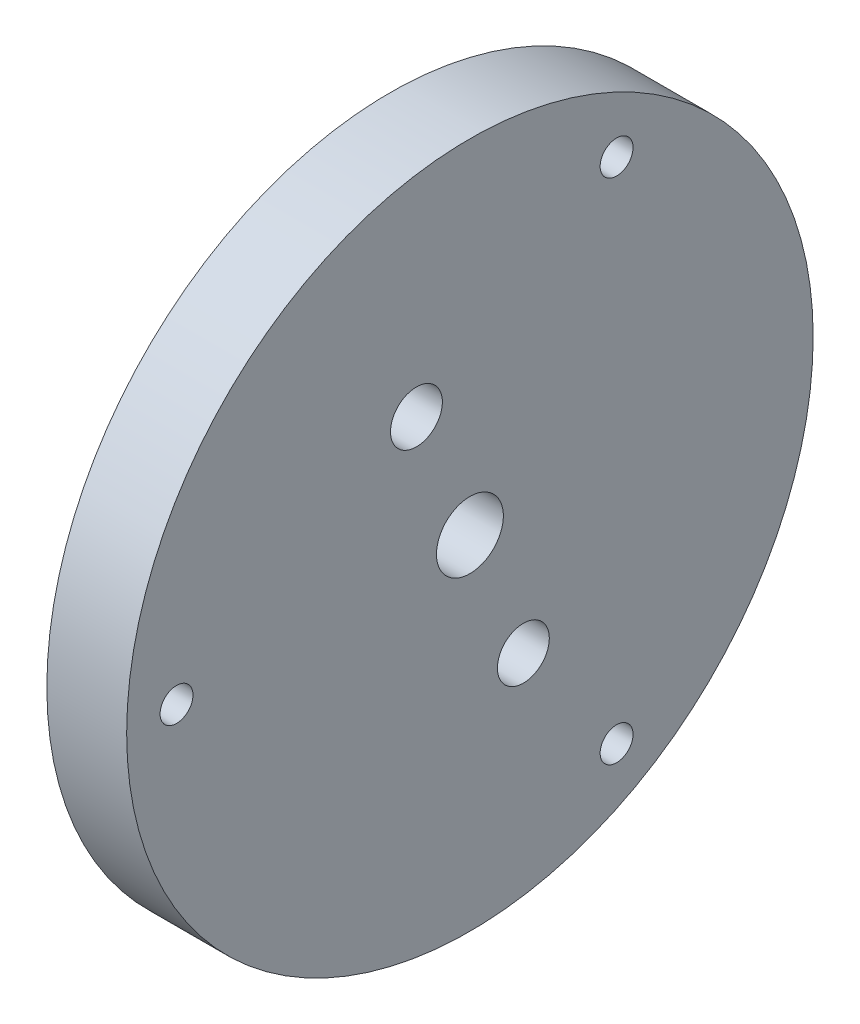
ISO-10303-21;
HEADER;
FILE_DESCRIPTION(('STEP AP214'),'2;1');
FILE_NAME('part.step','',(''),(''),'','','');
FILE_SCHEMA(('AUTOMOTIVE_DESIGN { 1 0 10303 214 1 1 1 1 }'));
ENDSEC;
DATA;
#1=APPLICATION_CONTEXT('core data for automotive mechanical design processes');
#2=APPLICATION_PROTOCOL_DEFINITION('international standard','automotive_design',2000,#1);
#3=PRODUCT_CONTEXT('',#1,'mechanical');
#4=PRODUCT('Part','Part','',(#3));
#5=PRODUCT_RELATED_PRODUCT_CATEGORY('part','',(#4));
#6=PRODUCT_DEFINITION_FORMATION('','',#4);
#7=PRODUCT_DEFINITION_CONTEXT('part definition',#1,'design');
#8=PRODUCT_DEFINITION('design','',#6,#7);
#9=PRODUCT_DEFINITION_SHAPE('','',#8);
#10=(LENGTH_UNIT() NAMED_UNIT(*) SI_UNIT(.MILLI.,.METRE.));
#11=(NAMED_UNIT(*) PLANE_ANGLE_UNIT() SI_UNIT($,.RADIAN.));
#12=(NAMED_UNIT(*) SI_UNIT($,.STERADIAN.) SOLID_ANGLE_UNIT());
#13=UNCERTAINTY_MEASURE_WITH_UNIT(LENGTH_MEASURE(1.E-05),#10,'distance_accuracy_value','');
#14=(GEOMETRIC_REPRESENTATION_CONTEXT(3) GLOBAL_UNCERTAINTY_ASSIGNED_CONTEXT((#13)) GLOBAL_UNIT_ASSIGNED_CONTEXT((#10,
#11,#12)) REPRESENTATION_CONTEXT('',''));
#15=CARTESIAN_POINT('',(0.,0.,0.));
#16=DIRECTION('',(0.,0.,1.));
#17=DIRECTION('',(1.,0.,0.));
#18=AXIS2_PLACEMENT_3D('',#15,#16,#17);
#19=CARTESIAN_POINT('',(148.7,34.4,0.));
#20=DIRECTION('',(1.,0.,0.));
#21=DIRECTION('',(0.,0.,-1.));
#22=AXIS2_PLACEMENT_3D('',#19,#20,#21);
#23=PLANE('',#22);
#24=CARTESIAN_POINT('',(148.7,25.4611468712625,-14.7));
#25=DIRECTION('',(1.,0.,0.));
#26=DIRECTION('',(0.,0.,-1.));
#27=AXIS2_PLACEMENT_3D('',#24,#25,#26);
#28=CIRCLE('',#27,1.65);
#29=CARTESIAN_POINT('',(148.7,25.4611468712625,-16.35));
#30=VERTEX_POINT('',#29);
#31=EDGE_CURVE('E60',#30,#30,#28,.F.);
#32=ORIENTED_EDGE('',*,*,#31,.F.);
#33=EDGE_LOOP('',(#32));
#34=FACE_BOUND('',#33,.T.);
#35=CARTESIAN_POINT('',(148.7,-25.4611468712625,-14.7));
#36=DIRECTION('',(1.,0.,0.));
#37=DIRECTION('',(0.,0.,-1.));
#38=AXIS2_PLACEMENT_3D('',#35,#36,#37);
#39=CIRCLE('',#38,1.65);
#40=CARTESIAN_POINT('',(148.7,-25.4611468712625,-16.35));
#41=VERTEX_POINT('',#40);
#42=EDGE_CURVE('E64',#41,#41,#39,.F.);
#43=ORIENTED_EDGE('',*,*,#42,.F.);
#44=EDGE_LOOP('',(#43));
#45=FACE_BOUND('',#44,.T.);
#46=CARTESIAN_POINT('',(148.7,0.,29.4));
#47=DIRECTION('',(1.,0.,0.));
#48=DIRECTION('',(0.,0.,-1.));
#49=AXIS2_PLACEMENT_3D('',#46,#47,#48);
#50=CIRCLE('',#49,1.65);
#51=CARTESIAN_POINT('',(148.7,0.,27.75));
#52=VERTEX_POINT('',#51);
#53=EDGE_CURVE('E68',#52,#52,#50,.F.);
#54=ORIENTED_EDGE('',*,*,#53,.F.);
#55=EDGE_LOOP('',(#54));
#56=FACE_BOUND('',#55,.T.);
#57=CARTESIAN_POINT('',(148.7,-12.934313455158,-5.35756805311126));
#58=DIRECTION('',(1.,0.,0.));
#59=DIRECTION('',(0.,0.,-1.));
#60=AXIS2_PLACEMENT_3D('',#57,#58,#59);
#61=CIRCLE('',#60,2.6);
#62=CARTESIAN_POINT('',(148.7,-12.934313455158,-7.95756805311126));
#63=VERTEX_POINT('',#62);
#64=EDGE_CURVE('E72',#63,#63,#61,.F.);
#65=ORIENTED_EDGE('',*,*,#64,.F.);
#66=EDGE_LOOP('',(#65));
#67=FACE_BOUND('',#66,.T.);
#68=CARTESIAN_POINT('',(148.7,12.934313455158,5.35756805311126));
#69=DIRECTION('',(1.,0.,0.));
#70=DIRECTION('',(0.,0.,-1.));
#71=AXIS2_PLACEMENT_3D('',#68,#69,#70);
#72=CIRCLE('',#71,2.6);
#73=CARTESIAN_POINT('',(148.7,12.934313455158,2.75756805311126));
#74=VERTEX_POINT('',#73);
#75=EDGE_CURVE('E76',#74,#74,#72,.F.);
#76=ORIENTED_EDGE('',*,*,#75,.F.);
#77=EDGE_LOOP('',(#76));
#78=FACE_BOUND('',#77,.T.);
#79=CARTESIAN_POINT('',(148.7,0.,0.));
#80=DIRECTION('',(-1.,0.,0.));
#81=DIRECTION('',(0.,0.,1.));
#82=AXIS2_PLACEMENT_3D('',#79,#80,#81);
#83=CIRCLE('',#82,3.35);
#84=CARTESIAN_POINT('',(148.7,0.,3.35));
#85=VERTEX_POINT('',#84);
#86=EDGE_CURVE('E10',#85,#85,#83,.T.);
#87=ORIENTED_EDGE('',*,*,#86,.F.);
#88=EDGE_LOOP('',(#87));
#89=FACE_BOUND('',#88,.T.);
#90=CARTESIAN_POINT('',(148.7,0.,0.));
#91=DIRECTION('',(-1.,0.,0.));
#92=DIRECTION('',(0.,0.,1.));
#93=AXIS2_PLACEMENT_3D('',#90,#91,#92);
#94=CIRCLE('',#93,34.4);
#95=CARTESIAN_POINT('',(148.7,0.,34.4));
#96=VERTEX_POINT('',#95);
#97=EDGE_CURVE('E54',#96,#96,#94,.T.);
#98=ORIENTED_EDGE('',*,*,#97,.T.);
#99=EDGE_LOOP('',(#98));
#100=FACE_BOUND('',#99,.T.);
#101=ADVANCED_FACE('F37',(#34,#45,#56,#67,#78,#89,#100),#23,.F.);
#102=CARTESIAN_POINT('',(-110.,0.,0.));
#103=DIRECTION('',(-1.,0.,0.));
#104=DIRECTION('',(0.,0.,1.));
#105=AXIS2_PLACEMENT_3D('',#102,#103,#104);
#106=CYLINDRICAL_SURFACE('',#105,3.35);
#107=CARTESIAN_POINT('',(156.7,0.,0.));
#108=DIRECTION('',(-1.,0.,0.));
#109=DIRECTION('',(0.,0.,1.));
#110=AXIS2_PLACEMENT_3D('',#107,#108,#109);
#111=CIRCLE('',#110,3.35);
#112=CARTESIAN_POINT('',(156.7,0.,3.35));
#113=VERTEX_POINT('',#112);
#114=EDGE_CURVE('E44',#113,#113,#111,.T.);
#115=ORIENTED_EDGE('',*,*,#114,.F.);
#116=EDGE_LOOP('',(#115));
#117=FACE_BOUND('',#116,.T.);
#118=ORIENTED_EDGE('',*,*,#86,.T.);
#119=EDGE_LOOP('',(#118));
#120=FACE_BOUND('',#119,.T.);
#121=ADVANCED_FACE('F108',(#117,#120),#106,.F.);
#122=CARTESIAN_POINT('',(156.7,3.35,0.));
#123=DIRECTION('',(-1.,0.,0.));
#124=DIRECTION('',(0.,0.,1.));
#125=AXIS2_PLACEMENT_3D('',#122,#123,#124);
#126=PLANE('',#125);
#127=CARTESIAN_POINT('',(156.7,25.4611468712625,-14.7));
#128=DIRECTION('',(1.,0.,0.));
#129=DIRECTION('',(0.,0.,-1.));
#130=AXIS2_PLACEMENT_3D('',#127,#128,#129);
#131=CIRCLE('',#130,1.65);
#132=CARTESIAN_POINT('',(156.7,25.4611468712625,-16.35));
#133=VERTEX_POINT('',#132);
#134=EDGE_CURVE('E85',#133,#133,#131,.T.);
#135=ORIENTED_EDGE('',*,*,#134,.F.);
#136=EDGE_LOOP('',(#135));
#137=FACE_BOUND('',#136,.T.);
#138=CARTESIAN_POINT('',(156.7,-25.4611468712625,-14.7));
#139=DIRECTION('',(1.,0.,0.));
#140=DIRECTION('',(0.,0.,-1.));
#141=AXIS2_PLACEMENT_3D('',#138,#139,#140);
#142=CIRCLE('',#141,1.65);
#143=CARTESIAN_POINT('',(156.7,-25.4611468712625,-16.35));
#144=VERTEX_POINT('',#143);
#145=EDGE_CURVE('E89',#144,#144,#142,.T.);
#146=ORIENTED_EDGE('',*,*,#145,.F.);
#147=EDGE_LOOP('',(#146));
#148=FACE_BOUND('',#147,.T.);
#149=CARTESIAN_POINT('',(156.7,0.,29.4));
#150=DIRECTION('',(1.,0.,0.));
#151=DIRECTION('',(0.,0.,-1.));
#152=AXIS2_PLACEMENT_3D('',#149,#150,#151);
#153=CIRCLE('',#152,1.65);
#154=CARTESIAN_POINT('',(156.7,0.,27.75));
#155=VERTEX_POINT('',#154);
#156=EDGE_CURVE('E93',#155,#155,#153,.T.);
#157=ORIENTED_EDGE('',*,*,#156,.F.);
#158=EDGE_LOOP('',(#157));
#159=FACE_BOUND('',#158,.T.);
#160=CARTESIAN_POINT('',(156.7,-12.934313455158,-5.35756805311126));
#161=DIRECTION('',(1.,0.,0.));
#162=DIRECTION('',(0.,0.,-1.));
#163=AXIS2_PLACEMENT_3D('',#160,#161,#162);
#164=CIRCLE('',#163,2.6);
#165=CARTESIAN_POINT('',(156.7,-12.934313455158,-7.95756805311126));
#166=VERTEX_POINT('',#165);
#167=EDGE_CURVE('E84',#166,#166,#164,.T.);
#168=ORIENTED_EDGE('',*,*,#167,.F.);
#169=EDGE_LOOP('',(#168));
#170=FACE_BOUND('',#169,.T.);
#171=CARTESIAN_POINT('',(156.7,12.934313455158,5.35756805311126));
#172=DIRECTION('',(1.,0.,0.));
#173=DIRECTION('',(0.,0.,-1.));
#174=AXIS2_PLACEMENT_3D('',#171,#172,#173);
#175=CIRCLE('',#174,2.6);
#176=CARTESIAN_POINT('',(156.7,12.934313455158,2.75756805311126));
#177=VERTEX_POINT('',#176);
#178=EDGE_CURVE('E80',#177,#177,#175,.T.);
#179=ORIENTED_EDGE('',*,*,#178,.F.);
#180=EDGE_LOOP('',(#179));
#181=FACE_BOUND('',#180,.T.);
#182=CARTESIAN_POINT('',(156.7,0.,0.));
#183=DIRECTION('',(-1.,0.,0.));
#184=DIRECTION('',(0.,0.,1.));
#185=AXIS2_PLACEMENT_3D('',#182,#183,#184);
#186=CIRCLE('',#185,34.4);
#187=CARTESIAN_POINT('',(156.7,0.,34.4));
#188=VERTEX_POINT('',#187);
#189=EDGE_CURVE('E49',#188,#188,#186,.T.);
#190=ORIENTED_EDGE('',*,*,#189,.F.);
#191=EDGE_LOOP('',(#190));
#192=FACE_BOUND('',#191,.T.);
#193=ORIENTED_EDGE('',*,*,#114,.T.);
#194=EDGE_LOOP('',(#193));
#195=FACE_BOUND('',#194,.T.);
#196=ADVANCED_FACE('F104',(#137,#148,#159,#170,#181,#192,#195),#126,.F.);
#197=CARTESIAN_POINT('',(-110.,0.,0.));
#198=DIRECTION('',(-1.,0.,0.));
#199=DIRECTION('',(0.,0.,1.));
#200=AXIS2_PLACEMENT_3D('',#197,#198,#199);
#201=CYLINDRICAL_SURFACE('',#200,34.4);
#202=ORIENTED_EDGE('',*,*,#97,.F.);
#203=EDGE_LOOP('',(#202));
#204=FACE_BOUND('',#203,.T.);
#205=ORIENTED_EDGE('',*,*,#189,.T.);
#206=EDGE_LOOP('',(#205));
#207=FACE_BOUND('',#206,.T.);
#208=ADVANCED_FACE('F107',(#204,#207),#201,.T.);
#209=CARTESIAN_POINT('',(148.7,12.934313455158,5.35756805311126));
#210=DIRECTION('',(-1.,0.,0.));
#211=DIRECTION('',(0.,0.,1.));
#212=AXIS2_PLACEMENT_3D('',#209,#210,#211);
#213=CYLINDRICAL_SURFACE('',#212,2.6);
#214=ORIENTED_EDGE('',*,*,#178,.T.);
#215=EDGE_LOOP('',(#214));
#216=FACE_BOUND('',#215,.T.);
#217=ORIENTED_EDGE('',*,*,#75,.T.);
#218=EDGE_LOOP('',(#217));
#219=FACE_BOUND('',#218,.T.);
#220=ADVANCED_FACE('F116',(#216,#219),#213,.F.);
#221=CARTESIAN_POINT('',(148.7,-12.934313455158,-5.35756805311126));
#222=DIRECTION('',(-1.,0.,0.));
#223=DIRECTION('',(0.,0.,1.));
#224=AXIS2_PLACEMENT_3D('',#221,#222,#223);
#225=CYLINDRICAL_SURFACE('',#224,2.6);
#226=ORIENTED_EDGE('',*,*,#167,.T.);
#227=EDGE_LOOP('',(#226));
#228=FACE_BOUND('',#227,.T.);
#229=ORIENTED_EDGE('',*,*,#64,.T.);
#230=EDGE_LOOP('',(#229));
#231=FACE_BOUND('',#230,.T.);
#232=ADVANCED_FACE('F101',(#228,#231),#225,.F.);
#233=CARTESIAN_POINT('',(148.7,0.,29.4));
#234=DIRECTION('',(-1.,0.,0.));
#235=DIRECTION('',(0.,0.,1.));
#236=AXIS2_PLACEMENT_3D('',#233,#234,#235);
#237=CYLINDRICAL_SURFACE('',#236,1.65);
#238=ORIENTED_EDGE('',*,*,#156,.T.);
#239=EDGE_LOOP('',(#238));
#240=FACE_BOUND('',#239,.T.);
#241=ORIENTED_EDGE('',*,*,#53,.T.);
#242=EDGE_LOOP('',(#241));
#243=FACE_BOUND('',#242,.T.);
#244=ADVANCED_FACE('F144',(#240,#243),#237,.F.);
#245=CARTESIAN_POINT('',(148.7,-25.4611468712625,-14.7));
#246=DIRECTION('',(-1.,0.,0.));
#247=DIRECTION('',(0.,0.,1.));
#248=AXIS2_PLACEMENT_3D('',#245,#246,#247);
#249=CYLINDRICAL_SURFACE('',#248,1.65);
#250=ORIENTED_EDGE('',*,*,#145,.T.);
#251=EDGE_LOOP('',(#250));
#252=FACE_BOUND('',#251,.T.);
#253=ORIENTED_EDGE('',*,*,#42,.T.);
#254=EDGE_LOOP('',(#253));
#255=FACE_BOUND('',#254,.T.);
#256=ADVANCED_FACE('F149',(#252,#255),#249,.F.);
#257=CARTESIAN_POINT('',(148.7,25.4611468712625,-14.7));
#258=DIRECTION('',(-1.,0.,0.));
#259=DIRECTION('',(0.,0.,1.));
#260=AXIS2_PLACEMENT_3D('',#257,#258,#259);
#261=CYLINDRICAL_SURFACE('',#260,1.65);
#262=ORIENTED_EDGE('',*,*,#134,.T.);
#263=EDGE_LOOP('',(#262));
#264=FACE_BOUND('',#263,.T.);
#265=ORIENTED_EDGE('',*,*,#31,.T.);
#266=EDGE_LOOP('',(#265));
#267=FACE_BOUND('',#266,.T.);
#268=ADVANCED_FACE('F155',(#264,#267),#261,.F.);
#269=CLOSED_SHELL('',(#101,#121,#196,#208,#220,#232,#244,#256,#268));
#270=MANIFOLD_SOLID_BREP('B2',#269);
#271=ADVANCED_BREP_SHAPE_REPRESENTATION('',(#18,#270),#14);
#272=SHAPE_DEFINITION_REPRESENTATION(#9,#271);
ENDSEC;
END-ISO-10303-21;
